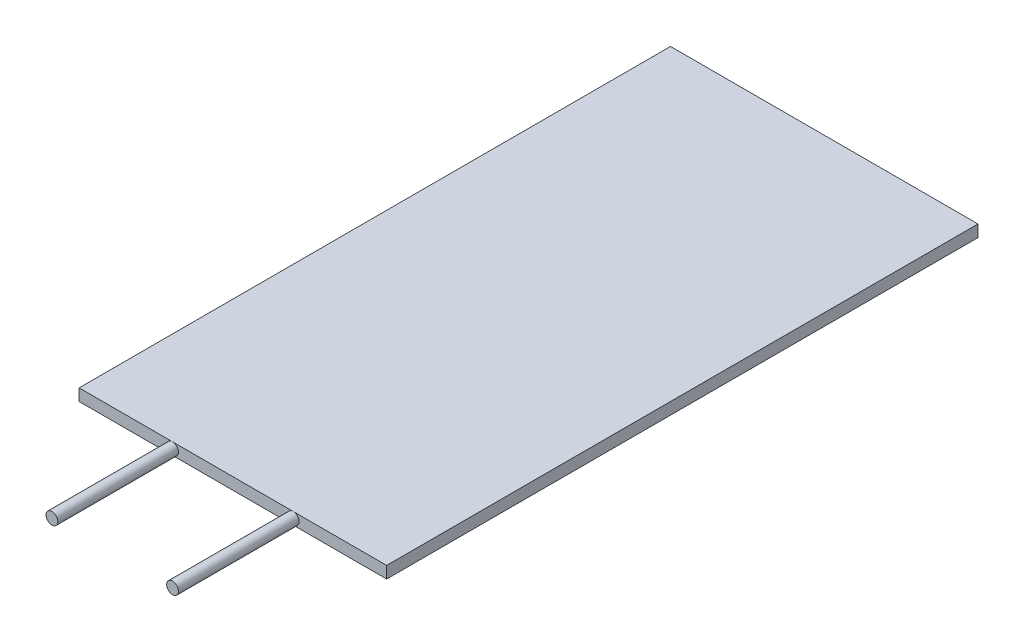
ISO-10303-21;
HEADER;
FILE_DESCRIPTION(('STEP AP214'),'2;1');
FILE_NAME('part.step','',(''),(''),'','','');
FILE_SCHEMA(('AUTOMOTIVE_DESIGN { 1 0 10303 214 1 1 1 1 }'));
ENDSEC;
DATA;
#1=APPLICATION_CONTEXT('core data for automotive mechanical design processes');
#2=APPLICATION_PROTOCOL_DEFINITION('international standard','automotive_design',2000,#1);
#3=PRODUCT_CONTEXT('',#1,'mechanical');
#4=PRODUCT('Part','Part','',(#3));
#5=PRODUCT_RELATED_PRODUCT_CATEGORY('part','',(#4));
#6=PRODUCT_DEFINITION_FORMATION('','',#4);
#7=PRODUCT_DEFINITION_CONTEXT('part definition',#1,'design');
#8=PRODUCT_DEFINITION('design','',#6,#7);
#9=PRODUCT_DEFINITION_SHAPE('','',#8);
#10=(LENGTH_UNIT() NAMED_UNIT(*) SI_UNIT(.MILLI.,.METRE.));
#11=(NAMED_UNIT(*) PLANE_ANGLE_UNIT() SI_UNIT($,.RADIAN.));
#12=(NAMED_UNIT(*) SI_UNIT($,.STERADIAN.) SOLID_ANGLE_UNIT());
#13=UNCERTAINTY_MEASURE_WITH_UNIT(LENGTH_MEASURE(1.E-05),#10,'distance_accuracy_value','');
#14=(GEOMETRIC_REPRESENTATION_CONTEXT(3) GLOBAL_UNCERTAINTY_ASSIGNED_CONTEXT((#13)) GLOBAL_UNIT_ASSIGNED_CONTEXT((#10,
#11,#12)) REPRESENTATION_CONTEXT('',''));
#15=CARTESIAN_POINT('',(0.,0.,0.));
#16=DIRECTION('',(0.,0.,1.));
#17=DIRECTION('',(1.,0.,0.));
#18=AXIS2_PLACEMENT_3D('',#15,#16,#17);
#19=CARTESIAN_POINT('',(-6.5,0.5,12.5));
#20=DIRECTION('',(0.,0.,-1.));
#21=DIRECTION('',(-1.,0.,0.));
#22=AXIS2_PLACEMENT_3D('',#19,#20,#21);
#23=PLANE('',#22);
#24=CARTESIAN_POINT('',(2.55,0.25,12.5));
#25=DIRECTION('',(0.,0.,1.));
#26=DIRECTION('',(1.,0.,0.));
#27=AXIS2_PLACEMENT_3D('',#24,#25,#26);
#28=CIRCLE('',#27,0.25);
#29=CARTESIAN_POINT('',(2.55,0.,12.5));
#30=VERTEX_POINT('',#29);
#31=CARTESIAN_POINT('',(2.55,0.5,12.5));
#32=VERTEX_POINT('',#31);
#33=EDGE_CURVE('E102',#30,#32,#28,.T.);
#34=ORIENTED_EDGE('',*,*,#33,.F.);
#35=DIRECTION('',(1.,0.,0.));
#36=VECTOR('',#35,1.);
#37=CARTESIAN_POINT('',(-6.5,0.,12.5));
#38=LINE('',#37,#36);
#39=CARTESIAN_POINT('',(6.5,0.,12.5));
#40=VERTEX_POINT('',#39);
#41=EDGE_CURVE('E90',#30,#40,#38,.T.);
#42=ORIENTED_EDGE('',*,*,#41,.T.);
#43=DIRECTION('',(0.,-1.,0.));
#44=VECTOR('',#43,1.);
#45=CARTESIAN_POINT('',(6.5,0.5,12.5));
#46=LINE('',#45,#44);
#47=CARTESIAN_POINT('',(6.5,0.5,12.5));
#48=VERTEX_POINT('',#47);
#49=EDGE_CURVE('E125',#48,#40,#46,.T.);
#50=ORIENTED_EDGE('',*,*,#49,.F.);
#51=DIRECTION('',(1.,0.,0.));
#52=VECTOR('',#51,1.);
#53=CARTESIAN_POINT('',(-6.5,0.5,12.5));
#54=LINE('',#53,#52);
#55=EDGE_CURVE('E103',#32,#48,#54,.T.);
#56=ORIENTED_EDGE('',*,*,#55,.F.);
#57=EDGE_LOOP('',(#34,#42,#50,#56));
#58=FACE_BOUND('',#57,.T.);
#59=ADVANCED_FACE('F33',(#58),#23,.F.);
#60=CARTESIAN_POINT('',(-2.55,0.25,12.5));
#61=DIRECTION('',(0.,0.,1.));
#62=DIRECTION('',(1.,0.,0.));
#63=AXIS2_PLACEMENT_3D('',#60,#61,#62);
#64=CIRCLE('',#63,0.25);
#65=CARTESIAN_POINT('',(-2.55,0.5,12.5));
#66=VERTEX_POINT('',#65);
#67=CARTESIAN_POINT('',(-2.55,0.,12.5));
#68=VERTEX_POINT('',#67);
#69=EDGE_CURVE('E43',#66,#68,#64,.T.);
#70=ORIENTED_EDGE('',*,*,#69,.F.);
#71=CARTESIAN_POINT('',(-6.5,0.5,12.5));
#72=VERTEX_POINT('',#71);
#73=EDGE_CURVE('E123',#72,#66,#54,.T.);
#74=ORIENTED_EDGE('',*,*,#73,.F.);
#75=DIRECTION('',(0.,-1.,0.));
#76=VECTOR('',#75,1.);
#77=CARTESIAN_POINT('',(-6.5,0.5,12.5));
#78=LINE('',#77,#76);
#79=CARTESIAN_POINT('',(-6.5,0.,12.5));
#80=VERTEX_POINT('',#79);
#81=EDGE_CURVE('E132',#72,#80,#78,.T.);
#82=ORIENTED_EDGE('',*,*,#81,.T.);
#83=EDGE_CURVE('E89',#80,#68,#38,.T.);
#84=ORIENTED_EDGE('',*,*,#83,.T.);
#85=EDGE_LOOP('',(#70,#74,#82,#84));
#86=FACE_BOUND('',#85,.T.);
#87=ADVANCED_FACE('F151',(#86),#23,.F.);
#88=CARTESIAN_POINT('',(6.5,0.5,12.5));
#89=DIRECTION('',(-1.,0.,0.));
#90=DIRECTION('',(0.,0.,1.));
#91=AXIS2_PLACEMENT_3D('',#88,#89,#90);
#92=PLANE('',#91);
#93=DIRECTION('',(0.,0.,-1.));
#94=VECTOR('',#93,1.);
#95=CARTESIAN_POINT('',(6.5,0.,12.5));
#96=LINE('',#95,#94);
#97=CARTESIAN_POINT('',(6.5,0.,-12.5));
#98=VERTEX_POINT('',#97);
#99=EDGE_CURVE('E96',#40,#98,#96,.T.);
#100=ORIENTED_EDGE('',*,*,#99,.T.);
#101=DIRECTION('',(0.,-1.,0.));
#102=VECTOR('',#101,1.);
#103=CARTESIAN_POINT('',(6.5,0.5,-12.5));
#104=LINE('',#103,#102);
#105=CARTESIAN_POINT('',(6.5,0.5,-12.5));
#106=VERTEX_POINT('',#105);
#107=EDGE_CURVE('E37',#106,#98,#104,.T.);
#108=ORIENTED_EDGE('',*,*,#107,.F.);
#109=DIRECTION('',(0.,0.,-1.));
#110=VECTOR('',#109,1.);
#111=CARTESIAN_POINT('',(6.5,0.5,12.5));
#112=LINE('',#111,#110);
#113=EDGE_CURVE('E116',#48,#106,#112,.T.);
#114=ORIENTED_EDGE('',*,*,#113,.F.);
#115=ORIENTED_EDGE('',*,*,#49,.T.);
#116=EDGE_LOOP('',(#100,#108,#114,#115));
#117=FACE_BOUND('',#116,.T.);
#118=ADVANCED_FACE('F35',(#117),#92,.F.);
#119=CARTESIAN_POINT('',(-6.5,0.5,-12.5));
#120=DIRECTION('',(0.,0.,1.));
#121=DIRECTION('',(1.,0.,0.));
#122=AXIS2_PLACEMENT_3D('',#119,#120,#121);
#123=PLANE('',#122);
#124=DIRECTION('',(-1.,0.,0.));
#125=VECTOR('',#124,1.);
#126=CARTESIAN_POINT('',(-6.5,0.,-12.5));
#127=LINE('',#126,#125);
#128=CARTESIAN_POINT('',(-6.5,0.,-12.5));
#129=VERTEX_POINT('',#128);
#130=EDGE_CURVE('E128',#98,#129,#127,.T.);
#131=ORIENTED_EDGE('',*,*,#130,.T.);
#132=DIRECTION('',(0.,-1.,0.));
#133=VECTOR('',#132,1.);
#134=CARTESIAN_POINT('',(-6.5,0.5,-12.5));
#135=LINE('',#134,#133);
#136=CARTESIAN_POINT('',(-6.5,0.5,-12.5));
#137=VERTEX_POINT('',#136);
#138=EDGE_CURVE('E134',#137,#129,#135,.T.);
#139=ORIENTED_EDGE('',*,*,#138,.F.);
#140=DIRECTION('',(-1.,0.,0.));
#141=VECTOR('',#140,1.);
#142=CARTESIAN_POINT('',(-6.5,0.5,-12.5));
#143=LINE('',#142,#141);
#144=EDGE_CURVE('E119',#106,#137,#143,.T.);
#145=ORIENTED_EDGE('',*,*,#144,.F.);
#146=ORIENTED_EDGE('',*,*,#107,.T.);
#147=EDGE_LOOP('',(#131,#139,#145,#146));
#148=FACE_BOUND('',#147,.T.);
#149=ADVANCED_FACE('F143',(#148),#123,.F.);
#150=CARTESIAN_POINT('',(-6.5,0.5,12.5));
#151=DIRECTION('',(1.,0.,0.));
#152=DIRECTION('',(0.,0.,-1.));
#153=AXIS2_PLACEMENT_3D('',#150,#151,#152);
#154=PLANE('',#153);
#155=DIRECTION('',(0.,0.,1.));
#156=VECTOR('',#155,1.);
#157=CARTESIAN_POINT('',(-6.5,0.,12.5));
#158=LINE('',#157,#156);
#159=EDGE_CURVE('E100',#129,#80,#158,.T.);
#160=ORIENTED_EDGE('',*,*,#159,.T.);
#161=ORIENTED_EDGE('',*,*,#81,.F.);
#162=DIRECTION('',(0.,0.,1.));
#163=VECTOR('',#162,1.);
#164=CARTESIAN_POINT('',(-6.5,0.5,12.5));
#165=LINE('',#164,#163);
#166=EDGE_CURVE('E121',#137,#72,#165,.T.);
#167=ORIENTED_EDGE('',*,*,#166,.F.);
#168=ORIENTED_EDGE('',*,*,#138,.T.);
#169=EDGE_LOOP('',(#160,#161,#167,#168));
#170=FACE_BOUND('',#169,.T.);
#171=ADVANCED_FACE('F174',(#170),#154,.F.);
#172=EDGE_CURVE('E50',#32,#30,#28,.T.);
#173=ORIENTED_EDGE('',*,*,#172,.F.);
#174=EDGE_CURVE('E126',#66,#32,#54,.T.);
#175=ORIENTED_EDGE('',*,*,#174,.F.);
#176=EDGE_CURVE('E11',#68,#66,#64,.T.);
#177=ORIENTED_EDGE('',*,*,#176,.F.);
#178=EDGE_CURVE('E83',#68,#30,#38,.T.);
#179=ORIENTED_EDGE('',*,*,#178,.T.);
#180=EDGE_LOOP('',(#173,#175,#177,#179));
#181=FACE_BOUND('',#180,.T.);
#182=ADVANCED_FACE('F85',(#181),#23,.F.);
#183=CARTESIAN_POINT('',(0.,0.5,0.));
#184=DIRECTION('',(0.,-1.,0.));
#185=DIRECTION('',(0.,0.,-1.));
#186=AXIS2_PLACEMENT_3D('',#183,#184,#185);
#187=PLANE('',#186);
#188=ORIENTED_EDGE('',*,*,#113,.T.);
#189=ORIENTED_EDGE('',*,*,#144,.T.);
#190=ORIENTED_EDGE('',*,*,#166,.T.);
#191=ORIENTED_EDGE('',*,*,#73,.T.);
#192=ORIENTED_EDGE('',*,*,#174,.T.);
#193=ORIENTED_EDGE('',*,*,#55,.T.);
#194=EDGE_LOOP('',(#188,#189,#190,#191,#192,#193));
#195=FACE_BOUND('',#194,.T.);
#196=ADVANCED_FACE('F147',(#195),#187,.F.);
#197=CARTESIAN_POINT('',(0.,0.,0.));
#198=DIRECTION('',(0.,-1.,0.));
#199=DIRECTION('',(0.,0.,-1.));
#200=AXIS2_PLACEMENT_3D('',#197,#198,#199);
#201=PLANE('',#200);
#202=ORIENTED_EDGE('',*,*,#99,.F.);
#203=ORIENTED_EDGE('',*,*,#41,.F.);
#204=ORIENTED_EDGE('',*,*,#178,.F.);
#205=ORIENTED_EDGE('',*,*,#83,.F.);
#206=ORIENTED_EDGE('',*,*,#159,.F.);
#207=ORIENTED_EDGE('',*,*,#130,.F.);
#208=EDGE_LOOP('',(#202,#203,#204,#205,#206,#207));
#209=FACE_BOUND('',#208,.T.);
#210=ADVANCED_FACE('F94',(#209),#201,.T.);
#211=CARTESIAN_POINT('',(-2.55,0.25,17.6));
#212=DIRECTION('',(0.,0.,-1.));
#213=DIRECTION('',(-1.,0.,0.));
#214=AXIS2_PLACEMENT_3D('',#211,#212,#213);
#215=CYLINDRICAL_SURFACE('',#214,0.25);
#216=CARTESIAN_POINT('',(-2.55,0.25,17.6));
#217=DIRECTION('',(0.,0.,1.));
#218=DIRECTION('',(1.,0.,0.));
#219=AXIS2_PLACEMENT_3D('',#216,#217,#218);
#220=CIRCLE('',#219,0.25);
#221=CARTESIAN_POINT('',(-2.3,0.25,17.6));
#222=VERTEX_POINT('',#221);
#223=EDGE_CURVE('E112',#222,#222,#220,.T.);
#224=ORIENTED_EDGE('',*,*,#223,.F.);
#225=EDGE_LOOP('',(#224));
#226=FACE_BOUND('',#225,.T.);
#227=ORIENTED_EDGE('',*,*,#69,.T.);
#228=ORIENTED_EDGE('',*,*,#176,.T.);
#229=EDGE_LOOP('',(#227,#228));
#230=FACE_BOUND('',#229,.T.);
#231=ADVANCED_FACE('F153',(#226,#230),#215,.T.);
#232=CARTESIAN_POINT('',(-2.55,0.25,17.6));
#233=DIRECTION('',(0.,0.,1.));
#234=DIRECTION('',(1.,0.,0.));
#235=AXIS2_PLACEMENT_3D('',#232,#233,#234);
#236=PLANE('',#235);
#237=ORIENTED_EDGE('',*,*,#223,.T.);
#238=EDGE_LOOP('',(#237));
#239=FACE_BOUND('',#238,.T.);
#240=ADVANCED_FACE('F155',(#239),#236,.T.);
#241=CARTESIAN_POINT('',(2.55,0.25,17.6));
#242=DIRECTION('',(0.,0.,-1.));
#243=DIRECTION('',(-1.,0.,0.));
#244=AXIS2_PLACEMENT_3D('',#241,#242,#243);
#245=CYLINDRICAL_SURFACE('',#244,0.25);
#246=CARTESIAN_POINT('',(2.55,0.25,17.6));
#247=DIRECTION('',(0.,0.,1.));
#248=DIRECTION('',(1.,0.,0.));
#249=AXIS2_PLACEMENT_3D('',#246,#247,#248);
#250=CIRCLE('',#249,0.25);
#251=CARTESIAN_POINT('',(2.8,0.25,17.6));
#252=VERTEX_POINT('',#251);
#253=EDGE_CURVE('E108',#252,#252,#250,.T.);
#254=ORIENTED_EDGE('',*,*,#253,.F.);
#255=EDGE_LOOP('',(#254));
#256=FACE_BOUND('',#255,.T.);
#257=ORIENTED_EDGE('',*,*,#172,.T.);
#258=ORIENTED_EDGE('',*,*,#33,.T.);
#259=EDGE_LOOP('',(#257,#258));
#260=FACE_BOUND('',#259,.T.);
#261=ADVANCED_FACE('F107',(#256,#260),#245,.T.);
#262=CARTESIAN_POINT('',(2.55,0.25,17.6));
#263=DIRECTION('',(0.,0.,1.));
#264=DIRECTION('',(1.,0.,0.));
#265=AXIS2_PLACEMENT_3D('',#262,#263,#264);
#266=PLANE('',#265);
#267=ORIENTED_EDGE('',*,*,#253,.T.);
#268=EDGE_LOOP('',(#267));
#269=FACE_BOUND('',#268,.T.);
#270=ADVANCED_FACE('F230',(#269),#266,.T.);
#271=CLOSED_SHELL('',(#59,#87,#118,#149,#171,#182,#196,#210,#231,#240,#261,#270));
#272=MANIFOLD_SOLID_BREP('B2',#271);
#273=ADVANCED_BREP_SHAPE_REPRESENTATION('',(#18,#272),#14);
#274=SHAPE_DEFINITION_REPRESENTATION(#9,#273);
ENDSEC;
END-ISO-10303-21;
